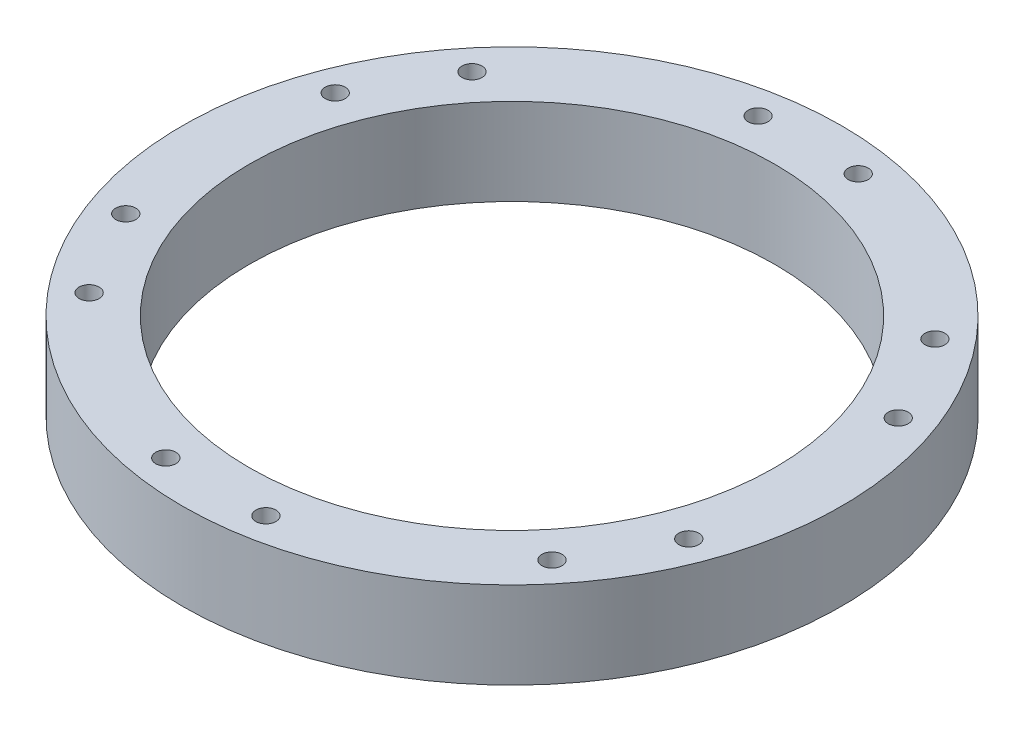
ISO-10303-21;
HEADER;
FILE_DESCRIPTION(('STEP AP214'),'2;1');
FILE_NAME('part.step','',(''),(''),'','','');
FILE_SCHEMA(('AUTOMOTIVE_DESIGN { 1 0 10303 214 1 1 1 1 }'));
ENDSEC;
DATA;
#1=APPLICATION_CONTEXT('core data for automotive mechanical design processes');
#2=APPLICATION_PROTOCOL_DEFINITION('international standard','automotive_design',2000,#1);
#3=PRODUCT_CONTEXT('',#1,'mechanical');
#4=PRODUCT('Part','Part','',(#3));
#5=PRODUCT_RELATED_PRODUCT_CATEGORY('part','',(#4));
#6=PRODUCT_DEFINITION_FORMATION('','',#4);
#7=PRODUCT_DEFINITION_CONTEXT('part definition',#1,'design');
#8=PRODUCT_DEFINITION('design','',#6,#7);
#9=PRODUCT_DEFINITION_SHAPE('','',#8);
#10=(LENGTH_UNIT() NAMED_UNIT(*) SI_UNIT(.MILLI.,.METRE.));
#11=(NAMED_UNIT(*) PLANE_ANGLE_UNIT() SI_UNIT($,.RADIAN.));
#12=(NAMED_UNIT(*) SI_UNIT($,.STERADIAN.) SOLID_ANGLE_UNIT());
#13=UNCERTAINTY_MEASURE_WITH_UNIT(LENGTH_MEASURE(1.E-05),#10,'distance_accuracy_value','');
#14=(GEOMETRIC_REPRESENTATION_CONTEXT(3) GLOBAL_UNCERTAINTY_ASSIGNED_CONTEXT((#13)) GLOBAL_UNIT_ASSIGNED_CONTEXT((#10,
#11,#12)) REPRESENTATION_CONTEXT('',''));
#15=CARTESIAN_POINT('',(0.,0.,0.));
#16=DIRECTION('',(0.,0.,1.));
#17=DIRECTION('',(1.,0.,0.));
#18=AXIS2_PLACEMENT_3D('',#15,#16,#17);
#19=CARTESIAN_POINT('',(0.,13.,0.));
#20=DIRECTION('',(0.,1.,0.));
#21=DIRECTION('',(0.,0.,1.));
#22=AXIS2_PLACEMENT_3D('',#19,#20,#21);
#23=PLANE('',#22);
#24=CARTESIAN_POINT('',(-34.6760653723481,13.,28.6804897150073));
#25=DIRECTION('',(0.,1.,0.));
#26=DIRECTION('',(-0.866025403784433,0.,0.50000000000001));
#27=AXIS2_PLACEMENT_3D('',#24,#25,#26);
#28=CIRCLE('',#27,1.5);
#29=CARTESIAN_POINT('',(-35.9751034780248,13.,29.4304897150073));
#30=VERTEX_POINT('',#29);
#31=EDGE_CURVE('E72',#30,#30,#28,.T.);
#32=ORIENTED_EDGE('',*,*,#31,.F.);
#33=EDGE_LOOP('',(#32));
#34=FACE_BOUND('',#33,.T.);
#35=CARTESIAN_POINT('',(-42.1760653723483,13.,15.6901086582408));
#36=DIRECTION('',(0.,1.,0.));
#37=DIRECTION('',(-0.866025403784433,0.,0.50000000000001));
#38=AXIS2_PLACEMENT_3D('',#35,#36,#37);
#39=CIRCLE('',#38,1.5);
#40=CARTESIAN_POINT('',(-43.475103478025,13.,16.4401086582408));
#41=VERTEX_POINT('',#40);
#42=EDGE_CURVE('E71',#41,#41,#39,.T.);
#43=ORIENTED_EDGE('',*,*,#42,.F.);
#44=EDGE_LOOP('',(#43));
#45=FACE_BOUND('',#44,.T.);
#46=CARTESIAN_POINT('',(-42.1760653723486,13.,-15.6901086582399));
#47=DIRECTION('',(0.,1.,0.));
#48=DIRECTION('',(-0.866025403784443,0.,-0.499999999999992));
#49=AXIS2_PLACEMENT_3D('',#46,#47,#48);
#50=CIRCLE('',#49,1.5);
#51=CARTESIAN_POINT('',(-43.4751034780253,13.,-16.4401086582399));
#52=VERTEX_POINT('',#51);
#53=EDGE_CURVE('E78',#52,#52,#50,.T.);
#54=ORIENTED_EDGE('',*,*,#53,.F.);
#55=EDGE_LOOP('',(#54));
#56=FACE_BOUND('',#55,.T.);
#57=CARTESIAN_POINT('',(-34.6760653723488,13.,-28.6804897150065));
#58=DIRECTION('',(0.,1.,0.));
#59=DIRECTION('',(-0.866025403784443,0.,-0.499999999999992));
#60=AXIS2_PLACEMENT_3D('',#57,#58,#59);
#61=CIRCLE('',#60,1.5);
#62=CARTESIAN_POINT('',(-35.9751034780254,13.,-29.4304897150065));
#63=VERTEX_POINT('',#62);
#64=EDGE_CURVE('E84',#63,#63,#61,.T.);
#65=ORIENTED_EDGE('',*,*,#64,.F.);
#66=EDGE_LOOP('',(#65));
#67=FACE_BOUND('',#66,.T.);
#68=CARTESIAN_POINT('',(-7.50000000000001,13.,-44.3705983732471));
#69=DIRECTION('',(0.,1.,0.));
#70=DIRECTION('',(0.,0.,-1.));
#71=AXIS2_PLACEMENT_3D('',#68,#69,#70);
#72=CIRCLE('',#71,1.5);
#73=CARTESIAN_POINT('',(-7.50000000000001,13.,-45.8705983732471));
#74=VERTEX_POINT('',#73);
#75=EDGE_CURVE('E90',#74,#74,#72,.T.);
#76=ORIENTED_EDGE('',*,*,#75,.F.);
#77=EDGE_LOOP('',(#76));
#78=FACE_BOUND('',#77,.T.);
#79=CARTESIAN_POINT('',(7.49999999999999,13.,-44.3705983732471));
#80=DIRECTION('',(0.,1.,0.));
#81=DIRECTION('',(0.,0.,-1.));
#82=AXIS2_PLACEMENT_3D('',#79,#80,#81);
#83=CIRCLE('',#82,1.5);
#84=CARTESIAN_POINT('',(7.49999999999999,13.,-45.8705983732471));
#85=VERTEX_POINT('',#84);
#86=EDGE_CURVE('E96',#85,#85,#83,.T.);
#87=ORIENTED_EDGE('',*,*,#86,.F.);
#88=EDGE_LOOP('',(#87));
#89=FACE_BOUND('',#88,.T.);
#90=CARTESIAN_POINT('',(34.6760653723484,13.,-28.680489715007));
#91=DIRECTION('',(0.,1.,0.));
#92=DIRECTION('',(0.866025403784436,0.,-0.500000000000004));
#93=AXIS2_PLACEMENT_3D('',#90,#91,#92);
#94=CIRCLE('',#93,1.5);
#95=CARTESIAN_POINT('',(35.975103478025,13.,-29.430489715007));
#96=VERTEX_POINT('',#95);
#97=EDGE_CURVE('E102',#96,#96,#94,.T.);
#98=ORIENTED_EDGE('',*,*,#97,.F.);
#99=EDGE_LOOP('',(#98));
#100=FACE_BOUND('',#99,.T.);
#101=CARTESIAN_POINT('',(42.1760653723484,13.,-15.6901086582405));
#102=DIRECTION('',(0.,1.,0.));
#103=DIRECTION('',(0.866025403784436,0.,-0.500000000000004));
#104=AXIS2_PLACEMENT_3D('',#101,#102,#103);
#105=CIRCLE('',#104,1.5);
#106=CARTESIAN_POINT('',(43.4751034780251,13.,-16.4401086582405));
#107=VERTEX_POINT('',#106);
#108=EDGE_CURVE('E108',#107,#107,#105,.T.);
#109=ORIENTED_EDGE('',*,*,#108,.F.);
#110=EDGE_LOOP('',(#109));
#111=FACE_BOUND('',#110,.T.);
#112=CARTESIAN_POINT('',(42.1760653723485,13.,15.6901086582402));
#113=DIRECTION('',(0.,1.,0.));
#114=DIRECTION('',(0.86602540378444,0.,0.499999999999998));
#115=AXIS2_PLACEMENT_3D('',#112,#113,#114);
#116=CIRCLE('',#115,1.5);
#117=CARTESIAN_POINT('',(43.4751034780252,13.,16.4401086582402));
#118=VERTEX_POINT('',#117);
#119=EDGE_CURVE('E114',#118,#118,#116,.T.);
#120=ORIENTED_EDGE('',*,*,#119,.F.);
#121=EDGE_LOOP('',(#120));
#122=FACE_BOUND('',#121,.T.);
#123=CARTESIAN_POINT('',(34.6760653723486,13.,28.6804897150068));
#124=DIRECTION('',(0.,1.,0.));
#125=DIRECTION('',(0.86602540378444,0.,0.499999999999998));
#126=AXIS2_PLACEMENT_3D('',#123,#124,#125);
#127=CIRCLE('',#126,1.5);
#128=CARTESIAN_POINT('',(35.9751034780252,13.,29.4304897150068));
#129=VERTEX_POINT('',#128);
#130=EDGE_CURVE('E64',#129,#129,#127,.T.);
#131=ORIENTED_EDGE('',*,*,#130,.F.);
#132=EDGE_LOOP('',(#131));
#133=FACE_BOUND('',#132,.T.);
#134=CARTESIAN_POINT('',(-7.49999999999999,13.,44.3705983732471));
#135=DIRECTION('',(0.,1.,0.));
#136=DIRECTION('',(0.,0.,1.));
#137=AXIS2_PLACEMENT_3D('',#134,#135,#136);
#138=CIRCLE('',#137,1.5);
#139=CARTESIAN_POINT('',(-7.49999999999999,13.,45.8705983732471));
#140=VERTEX_POINT('',#139);
#141=EDGE_CURVE('E53',#140,#140,#138,.T.);
#142=ORIENTED_EDGE('',*,*,#141,.F.);
#143=EDGE_LOOP('',(#142));
#144=FACE_BOUND('',#143,.T.);
#145=CARTESIAN_POINT('',(7.50000000000001,13.,44.3705983732471));
#146=DIRECTION('',(0.,1.,0.));
#147=DIRECTION('',(0.,0.,1.));
#148=AXIS2_PLACEMENT_3D('',#145,#146,#147);
#149=CIRCLE('',#148,1.5);
#150=CARTESIAN_POINT('',(7.50000000000001,13.,45.8705983732471));
#151=VERTEX_POINT('',#150);
#152=EDGE_CURVE('E54',#151,#151,#149,.T.);
#153=ORIENTED_EDGE('',*,*,#152,.F.);
#154=EDGE_LOOP('',(#153));
#155=FACE_BOUND('',#154,.T.);
#156=CARTESIAN_POINT('',(0.,13.,0.));
#157=DIRECTION('',(0.,1.,0.));
#158=DIRECTION('',(0.,0.,1.));
#159=AXIS2_PLACEMENT_3D('',#156,#157,#158);
#160=CIRCLE('',#159,49.375);
#161=CARTESIAN_POINT('',(0.,13.,-49.375));
#162=VERTEX_POINT('',#161);
#163=EDGE_CURVE('E10',#162,#162,#160,.T.);
#164=ORIENTED_EDGE('',*,*,#163,.T.);
#165=EDGE_LOOP('',(#164));
#166=FACE_BOUND('',#165,.T.);
#167=CARTESIAN_POINT('',(0.,13.,0.));
#168=DIRECTION('',(0.,1.,0.));
#169=DIRECTION('',(0.,0.,1.));
#170=AXIS2_PLACEMENT_3D('',#167,#168,#169);
#171=CIRCLE('',#170,39.375);
#172=CARTESIAN_POINT('',(0.,13.,-39.375));
#173=VERTEX_POINT('',#172);
#174=EDGE_CURVE('E42',#173,#173,#171,.T.);
#175=ORIENTED_EDGE('',*,*,#174,.F.);
#176=EDGE_LOOP('',(#175));
#177=FACE_BOUND('',#176,.T.);
#178=ADVANCED_FACE('F31',(#34,#45,#56,#67,#78,#89,#100,#111,#122,#133,#144,#155,#166,#177),#23,.T.);
#179=CARTESIAN_POINT('',(0.,0.,0.));
#180=DIRECTION('',(0.,1.,0.));
#181=DIRECTION('',(0.,0.,1.));
#182=AXIS2_PLACEMENT_3D('',#179,#180,#181);
#183=PLANE('',#182);
#184=CARTESIAN_POINT('',(-34.6760653723481,0.,28.6804897150073));
#185=DIRECTION('',(0.,1.,0.));
#186=DIRECTION('',(0.,0.,1.));
#187=AXIS2_PLACEMENT_3D('',#184,#185,#186);
#188=CIRCLE('',#187,1.5);
#189=CARTESIAN_POINT('',(-34.6760653723481,0.,30.1804897150073));
#190=VERTEX_POINT('',#189);
#191=EDGE_CURVE('E68',#190,#190,#188,.F.);
#192=ORIENTED_EDGE('',*,*,#191,.F.);
#193=EDGE_LOOP('',(#192));
#194=FACE_BOUND('',#193,.T.);
#195=CARTESIAN_POINT('',(-42.1760653723483,0.,15.6901086582408));
#196=DIRECTION('',(0.,1.,0.));
#197=DIRECTION('',(0.,0.,1.));
#198=AXIS2_PLACEMENT_3D('',#195,#196,#197);
#199=CIRCLE('',#198,1.5);
#200=CARTESIAN_POINT('',(-42.1760653723483,0.,17.1901086582408));
#201=VERTEX_POINT('',#200);
#202=EDGE_CURVE('E75',#201,#201,#199,.F.);
#203=ORIENTED_EDGE('',*,*,#202,.F.);
#204=EDGE_LOOP('',(#203));
#205=FACE_BOUND('',#204,.T.);
#206=CARTESIAN_POINT('',(-42.1760653723486,0.,-15.6901086582399));
#207=DIRECTION('',(0.,1.,0.));
#208=DIRECTION('',(0.,0.,1.));
#209=AXIS2_PLACEMENT_3D('',#206,#207,#208);
#210=CIRCLE('',#209,1.5);
#211=CARTESIAN_POINT('',(-42.1760653723486,0.,-14.1901086582399));
#212=VERTEX_POINT('',#211);
#213=EDGE_CURVE('E81',#212,#212,#210,.F.);
#214=ORIENTED_EDGE('',*,*,#213,.F.);
#215=EDGE_LOOP('',(#214));
#216=FACE_BOUND('',#215,.T.);
#217=CARTESIAN_POINT('',(-34.6760653723488,0.,-28.6804897150065));
#218=DIRECTION('',(0.,1.,0.));
#219=DIRECTION('',(0.,0.,1.));
#220=AXIS2_PLACEMENT_3D('',#217,#218,#219);
#221=CIRCLE('',#220,1.5);
#222=CARTESIAN_POINT('',(-34.6760653723488,0.,-27.1804897150065));
#223=VERTEX_POINT('',#222);
#224=EDGE_CURVE('E87',#223,#223,#221,.F.);
#225=ORIENTED_EDGE('',*,*,#224,.F.);
#226=EDGE_LOOP('',(#225));
#227=FACE_BOUND('',#226,.T.);
#228=CARTESIAN_POINT('',(-7.50000000000001,0.,-44.3705983732471));
#229=DIRECTION('',(0.,1.,0.));
#230=DIRECTION('',(0.,0.,1.));
#231=AXIS2_PLACEMENT_3D('',#228,#229,#230);
#232=CIRCLE('',#231,1.5);
#233=CARTESIAN_POINT('',(-7.50000000000001,0.,-42.8705983732471));
#234=VERTEX_POINT('',#233);
#235=EDGE_CURVE('E93',#234,#234,#232,.F.);
#236=ORIENTED_EDGE('',*,*,#235,.F.);
#237=EDGE_LOOP('',(#236));
#238=FACE_BOUND('',#237,.T.);
#239=CARTESIAN_POINT('',(7.49999999999999,0.,-44.3705983732471));
#240=DIRECTION('',(0.,1.,0.));
#241=DIRECTION('',(0.,0.,1.));
#242=AXIS2_PLACEMENT_3D('',#239,#240,#241);
#243=CIRCLE('',#242,1.5);
#244=CARTESIAN_POINT('',(7.49999999999999,0.,-42.8705983732471));
#245=VERTEX_POINT('',#244);
#246=EDGE_CURVE('E99',#245,#245,#243,.F.);
#247=ORIENTED_EDGE('',*,*,#246,.F.);
#248=EDGE_LOOP('',(#247));
#249=FACE_BOUND('',#248,.T.);
#250=CARTESIAN_POINT('',(34.6760653723484,0.,-28.680489715007));
#251=DIRECTION('',(0.,1.,0.));
#252=DIRECTION('',(0.,0.,1.));
#253=AXIS2_PLACEMENT_3D('',#250,#251,#252);
#254=CIRCLE('',#253,1.5);
#255=CARTESIAN_POINT('',(34.6760653723484,0.,-27.180489715007));
#256=VERTEX_POINT('',#255);
#257=EDGE_CURVE('E105',#256,#256,#254,.F.);
#258=ORIENTED_EDGE('',*,*,#257,.F.);
#259=EDGE_LOOP('',(#258));
#260=FACE_BOUND('',#259,.T.);
#261=CARTESIAN_POINT('',(42.1760653723484,0.,-15.6901086582405));
#262=DIRECTION('',(0.,1.,0.));
#263=DIRECTION('',(0.,0.,1.));
#264=AXIS2_PLACEMENT_3D('',#261,#262,#263);
#265=CIRCLE('',#264,1.5);
#266=CARTESIAN_POINT('',(42.1760653723484,0.,-14.1901086582405));
#267=VERTEX_POINT('',#266);
#268=EDGE_CURVE('E111',#267,#267,#265,.F.);
#269=ORIENTED_EDGE('',*,*,#268,.F.);
#270=EDGE_LOOP('',(#269));
#271=FACE_BOUND('',#270,.T.);
#272=CARTESIAN_POINT('',(42.1760653723485,0.,15.6901086582402));
#273=DIRECTION('',(0.,1.,0.));
#274=DIRECTION('',(0.,0.,1.));
#275=AXIS2_PLACEMENT_3D('',#272,#273,#274);
#276=CIRCLE('',#275,1.5);
#277=CARTESIAN_POINT('',(42.1760653723485,0.,17.1901086582402));
#278=VERTEX_POINT('',#277);
#279=EDGE_CURVE('E67',#278,#278,#276,.F.);
#280=ORIENTED_EDGE('',*,*,#279,.F.);
#281=EDGE_LOOP('',(#280));
#282=FACE_BOUND('',#281,.T.);
#283=CARTESIAN_POINT('',(34.6760653723486,0.,28.6804897150068));
#284=DIRECTION('',(0.,1.,0.));
#285=DIRECTION('',(0.,0.,1.));
#286=AXIS2_PLACEMENT_3D('',#283,#284,#285);
#287=CIRCLE('',#286,1.5);
#288=CARTESIAN_POINT('',(34.6760653723486,0.,30.1804897150068));
#289=VERTEX_POINT('',#288);
#290=EDGE_CURVE('E57',#289,#289,#287,.F.);
#291=ORIENTED_EDGE('',*,*,#290,.F.);
#292=EDGE_LOOP('',(#291));
#293=FACE_BOUND('',#292,.T.);
#294=CARTESIAN_POINT('',(-7.49999999999999,0.,44.3705983732471));
#295=DIRECTION('',(0.,1.,0.));
#296=DIRECTION('',(0.,0.,1.));
#297=AXIS2_PLACEMENT_3D('',#294,#295,#296);
#298=CIRCLE('',#297,1.5);
#299=CARTESIAN_POINT('',(-7.49999999999999,0.,45.8705983732471));
#300=VERTEX_POINT('',#299);
#301=EDGE_CURVE('E47',#300,#300,#298,.F.);
#302=ORIENTED_EDGE('',*,*,#301,.F.);
#303=EDGE_LOOP('',(#302));
#304=FACE_BOUND('',#303,.T.);
#305=CARTESIAN_POINT('',(7.50000000000001,0.,44.3705983732471));
#306=DIRECTION('',(0.,1.,0.));
#307=DIRECTION('',(0.,0.,1.));
#308=AXIS2_PLACEMENT_3D('',#305,#306,#307);
#309=CIRCLE('',#308,1.5);
#310=CARTESIAN_POINT('',(7.50000000000001,0.,45.8705983732471));
#311=VERTEX_POINT('',#310);
#312=EDGE_CURVE('E50',#311,#311,#309,.F.);
#313=ORIENTED_EDGE('',*,*,#312,.F.);
#314=EDGE_LOOP('',(#313));
#315=FACE_BOUND('',#314,.T.);
#316=CARTESIAN_POINT('',(0.,0.,0.));
#317=DIRECTION('',(0.,1.,0.));
#318=DIRECTION('',(0.,0.,1.));
#319=AXIS2_PLACEMENT_3D('',#316,#317,#318);
#320=CIRCLE('',#319,49.375);
#321=CARTESIAN_POINT('',(0.,0.,-49.375));
#322=VERTEX_POINT('',#321);
#323=EDGE_CURVE('E35',#322,#322,#320,.T.);
#324=ORIENTED_EDGE('',*,*,#323,.F.);
#325=EDGE_LOOP('',(#324));
#326=FACE_BOUND('',#325,.T.);
#327=CARTESIAN_POINT('',(0.,0.,0.));
#328=DIRECTION('',(0.,1.,0.));
#329=DIRECTION('',(0.,0.,1.));
#330=AXIS2_PLACEMENT_3D('',#327,#328,#329);
#331=CIRCLE('',#330,39.375);
#332=CARTESIAN_POINT('',(0.,0.,-39.375));
#333=VERTEX_POINT('',#332);
#334=EDGE_CURVE('E44',#333,#333,#331,.T.);
#335=ORIENTED_EDGE('',*,*,#334,.T.);
#336=EDGE_LOOP('',(#335));
#337=FACE_BOUND('',#336,.T.);
#338=ADVANCED_FACE('F127',(#194,#205,#216,#227,#238,#249,#260,#271,#282,#293,#304,#315,#326,
#337),#183,.F.);
#339=CARTESIAN_POINT('',(0.,13.,0.));
#340=DIRECTION('',(0.,-1.,0.));
#341=DIRECTION('',(0.,0.,-1.));
#342=AXIS2_PLACEMENT_3D('',#339,#340,#341);
#343=CYLINDRICAL_SURFACE('',#342,49.375);
#344=CARTESIAN_POINT('',(0.,13.,-49.375));
#345=CARTESIAN_POINT('',(0.,12.8645833333333,-49.375));
#346=CARTESIAN_POINT('',(0.,12.7291666666667,-49.375));
#347=CARTESIAN_POINT('',(0.,12.4583333333333,-49.375));
#348=CARTESIAN_POINT('',(0.,12.3229166666667,-49.375));
#349=CARTESIAN_POINT('',(0.,12.0520833333333,-49.375));
#350=CARTESIAN_POINT('',(0.,11.9166666666667,-49.375));
#351=CARTESIAN_POINT('',(0.,11.6458333333333,-49.375));
#352=CARTESIAN_POINT('',(0.,11.5104166666667,-49.375));
#353=CARTESIAN_POINT('',(0.,11.2395833333333,-49.375));
#354=CARTESIAN_POINT('',(0.,11.1041666666667,-49.375));
#355=CARTESIAN_POINT('',(0.,10.8333333333333,-49.375));
#356=CARTESIAN_POINT('',(0.,10.6979166666667,-49.375));
#357=CARTESIAN_POINT('',(0.,10.4270833333333,-49.375));
#358=CARTESIAN_POINT('',(0.,10.2916666666667,-49.375));
#359=CARTESIAN_POINT('',(0.,10.0208333333333,-49.375));
#360=CARTESIAN_POINT('',(0.,9.88541666666667,-49.375));
#361=CARTESIAN_POINT('',(0.,9.61458333333333,-49.375));
#362=CARTESIAN_POINT('',(0.,9.47916666666667,-49.375));
#363=CARTESIAN_POINT('',(0.,9.20833333333333,-49.375));
#364=CARTESIAN_POINT('',(0.,9.07291666666667,-49.375));
#365=CARTESIAN_POINT('',(0.,8.80208333333333,-49.375));
#366=CARTESIAN_POINT('',(0.,8.66666666666667,-49.375));
#367=CARTESIAN_POINT('',(0.,8.39583333333333,-49.375));
#368=CARTESIAN_POINT('',(0.,8.26041666666667,-49.375));
#369=CARTESIAN_POINT('',(0.,7.98958333333333,-49.375));
#370=CARTESIAN_POINT('',(0.,7.85416666666667,-49.375));
#371=CARTESIAN_POINT('',(0.,7.58333333333333,-49.375));
#372=CARTESIAN_POINT('',(0.,7.44791666666667,-49.375));
#373=CARTESIAN_POINT('',(0.,7.17708333333333,-49.375));
#374=CARTESIAN_POINT('',(0.,7.04166666666667,-49.375));
#375=CARTESIAN_POINT('',(0.,6.77083333333333,-49.375));
#376=CARTESIAN_POINT('',(0.,6.63541666666667,-49.375));
#377=CARTESIAN_POINT('',(0.,6.36458333333333,-49.375));
#378=CARTESIAN_POINT('',(0.,6.22916666666667,-49.375));
#379=CARTESIAN_POINT('',(0.,5.95833333333333,-49.375));
#380=CARTESIAN_POINT('',(0.,5.82291666666667,-49.375));
#381=CARTESIAN_POINT('',(0.,5.55208333333333,-49.375));
#382=CARTESIAN_POINT('',(0.,5.41666666666667,-49.375));
#383=CARTESIAN_POINT('',(0.,5.14583333333333,-49.375));
#384=CARTESIAN_POINT('',(0.,5.01041666666667,-49.375));
#385=CARTESIAN_POINT('',(0.,4.73958333333333,-49.375));
#386=CARTESIAN_POINT('',(0.,4.60416666666667,-49.375));
#387=CARTESIAN_POINT('',(0.,4.33333333333333,-49.375));
#388=CARTESIAN_POINT('',(0.,4.19791666666667,-49.375));
#389=CARTESIAN_POINT('',(0.,3.92708333333333,-49.375));
#390=CARTESIAN_POINT('',(0.,3.79166666666667,-49.375));
#391=CARTESIAN_POINT('',(0.,3.52083333333333,-49.375));
#392=CARTESIAN_POINT('',(0.,3.38541666666667,-49.375));
#393=CARTESIAN_POINT('',(0.,3.11458333333333,-49.375));
#394=CARTESIAN_POINT('',(0.,2.97916666666667,-49.375));
#395=CARTESIAN_POINT('',(0.,2.70833333333333,-49.375));
#396=CARTESIAN_POINT('',(0.,2.57291666666667,-49.375));
#397=CARTESIAN_POINT('',(0.,2.30208333333333,-49.375));
#398=CARTESIAN_POINT('',(0.,2.16666666666667,-49.375));
#399=CARTESIAN_POINT('',(0.,1.89583333333333,-49.375));
#400=CARTESIAN_POINT('',(0.,1.76041666666667,-49.375));
#401=CARTESIAN_POINT('',(0.,1.48958333333333,-49.375));
#402=CARTESIAN_POINT('',(0.,1.35416666666667,-49.375));
#403=CARTESIAN_POINT('',(0.,1.08333333333333,-49.375));
#404=CARTESIAN_POINT('',(0.,0.947916666666667,-49.375));
#405=CARTESIAN_POINT('',(0.,0.677083333333334,-49.375));
#406=CARTESIAN_POINT('',(0.,0.541666666666667,-49.375));
#407=CARTESIAN_POINT('',(0.,0.270833333333334,-49.375));
#408=CARTESIAN_POINT('',(0.,0.135416666666667,-49.375));
#409=CARTESIAN_POINT('',(0.,0.,-49.375));
#410=B_SPLINE_CURVE_WITH_KNOTS('',3,(#344,#345,#346,#347,#348,#349,#350,#351,#352,#353,#354,
#355,#356,#357,#358,#359,#360,#361,#362,#363,#364,#365,#366,#367,#368,#369,#370,#371,#372,#373,
#374,#375,#376,#377,#378,#379,#380,#381,#382,#383,#384,#385,#386,#387,#388,#389,#390,#391,#392,
#393,#394,#395,#396,#397,#398,#399,#400,#401,#402,#403,#404,#405,#406,#407,#408,#409),
.UNSPECIFIED.,.F.,.F.,(4,2,2,2,2,2,2,2,2,2,2,2,2,2,2,2,2,2,2,2,2,2,2,2,2,2,2,2,2,2,2,2,4),(0.,
0.406249999999999,0.812499999999999,1.21875,1.625,2.03125,2.4375,2.84375,3.25,3.65625,4.0625,
4.46875,4.875,5.28125,5.6875,6.09375,6.5,6.90625,7.3125,7.71875,8.125,8.53125,8.9375,9.34375,
9.75,10.15625,10.5625,10.96875,11.375,11.78125,12.1875,12.59375,13.),.UNSPECIFIED.);
#411=EDGE_CURVE('BSEAM33',#162,#322,#410,.T.);
#412=ORIENTED_EDGE('',*,*,#163,.F.);
#413=ORIENTED_EDGE('',*,*,#323,.T.);
#414=ORIENTED_EDGE('',*,*,#411,.T.);
#415=ORIENTED_EDGE('',*,*,#411,.F.);
#416=EDGE_LOOP('',(#412,#414,#413,#415));
#417=FACE_BOUND('',#416,.T.);
#418=ADVANCED_FACE('F33',(#417),#343,.T.);
#419=CARTESIAN_POINT('',(0.,13.,0.));
#420=DIRECTION('',(0.,-1.,0.));
#421=DIRECTION('',(0.,0.,-1.));
#422=AXIS2_PLACEMENT_3D('',#419,#420,#421);
#423=CYLINDRICAL_SURFACE('',#422,39.375);
#424=CARTESIAN_POINT('',(0.,13.,-39.375));
#425=CARTESIAN_POINT('',(0.,12.8645833333333,-39.375));
#426=CARTESIAN_POINT('',(0.,12.7291666666667,-39.375));
#427=CARTESIAN_POINT('',(0.,12.4583333333333,-39.375));
#428=CARTESIAN_POINT('',(0.,12.3229166666667,-39.375));
#429=CARTESIAN_POINT('',(0.,12.0520833333333,-39.375));
#430=CARTESIAN_POINT('',(0.,11.9166666666667,-39.375));
#431=CARTESIAN_POINT('',(0.,11.6458333333333,-39.375));
#432=CARTESIAN_POINT('',(0.,11.5104166666667,-39.375));
#433=CARTESIAN_POINT('',(0.,11.2395833333333,-39.375));
#434=CARTESIAN_POINT('',(0.,11.1041666666667,-39.375));
#435=CARTESIAN_POINT('',(0.,10.8333333333333,-39.375));
#436=CARTESIAN_POINT('',(0.,10.6979166666667,-39.375));
#437=CARTESIAN_POINT('',(0.,10.4270833333333,-39.375));
#438=CARTESIAN_POINT('',(0.,10.2916666666667,-39.375));
#439=CARTESIAN_POINT('',(0.,10.0208333333333,-39.375));
#440=CARTESIAN_POINT('',(0.,9.88541666666667,-39.375));
#441=CARTESIAN_POINT('',(0.,9.61458333333333,-39.375));
#442=CARTESIAN_POINT('',(0.,9.47916666666667,-39.375));
#443=CARTESIAN_POINT('',(0.,9.20833333333333,-39.375));
#444=CARTESIAN_POINT('',(0.,9.07291666666666,-39.375));
#445=CARTESIAN_POINT('',(0.,8.80208333333333,-39.375));
#446=CARTESIAN_POINT('',(0.,8.66666666666667,-39.375));
#447=CARTESIAN_POINT('',(0.,8.39583333333333,-39.375));
#448=CARTESIAN_POINT('',(0.,8.26041666666667,-39.375));
#449=CARTESIAN_POINT('',(0.,7.98958333333333,-39.375));
#450=CARTESIAN_POINT('',(0.,7.85416666666667,-39.375));
#451=CARTESIAN_POINT('',(0.,7.58333333333333,-39.375));
#452=CARTESIAN_POINT('',(0.,7.44791666666667,-39.375));
#453=CARTESIAN_POINT('',(0.,7.17708333333333,-39.375));
#454=CARTESIAN_POINT('',(0.,7.04166666666667,-39.375));
#455=CARTESIAN_POINT('',(0.,6.77083333333333,-39.375));
#456=CARTESIAN_POINT('',(0.,6.63541666666667,-39.375));
#457=CARTESIAN_POINT('',(0.,6.36458333333333,-39.375));
#458=CARTESIAN_POINT('',(0.,6.22916666666667,-39.375));
#459=CARTESIAN_POINT('',(0.,5.95833333333333,-39.375));
#460=CARTESIAN_POINT('',(0.,5.82291666666667,-39.375));
#461=CARTESIAN_POINT('',(0.,5.55208333333333,-39.375));
#462=CARTESIAN_POINT('',(0.,5.41666666666667,-39.375));
#463=CARTESIAN_POINT('',(0.,5.14583333333333,-39.375));
#464=CARTESIAN_POINT('',(0.,5.01041666666667,-39.375));
#465=CARTESIAN_POINT('',(0.,4.73958333333333,-39.375));
#466=CARTESIAN_POINT('',(0.,4.60416666666667,-39.375));
#467=CARTESIAN_POINT('',(0.,4.33333333333333,-39.375));
#468=CARTESIAN_POINT('',(0.,4.19791666666667,-39.375));
#469=CARTESIAN_POINT('',(0.,3.92708333333333,-39.375));
#470=CARTESIAN_POINT('',(0.,3.79166666666667,-39.375));
#471=CARTESIAN_POINT('',(0.,3.52083333333333,-39.375));
#472=CARTESIAN_POINT('',(0.,3.38541666666667,-39.375));
#473=CARTESIAN_POINT('',(0.,3.11458333333333,-39.375));
#474=CARTESIAN_POINT('',(0.,2.97916666666667,-39.375));
#475=CARTESIAN_POINT('',(0.,2.70833333333333,-39.375));
#476=CARTESIAN_POINT('',(0.,2.57291666666667,-39.375));
#477=CARTESIAN_POINT('',(0.,2.30208333333333,-39.375));
#478=CARTESIAN_POINT('',(0.,2.16666666666667,-39.375));
#479=CARTESIAN_POINT('',(0.,1.89583333333333,-39.375));
#480=CARTESIAN_POINT('',(0.,1.76041666666667,-39.375));
#481=CARTESIAN_POINT('',(0.,1.48958333333333,-39.375));
#482=CARTESIAN_POINT('',(0.,1.35416666666667,-39.375));
#483=CARTESIAN_POINT('',(0.,1.08333333333333,-39.375));
#484=CARTESIAN_POINT('',(0.,0.947916666666667,-39.375));
#485=CARTESIAN_POINT('',(0.,0.677083333333334,-39.375));
#486=CARTESIAN_POINT('',(0.,0.541666666666667,-39.375));
#487=CARTESIAN_POINT('',(0.,0.270833333333334,-39.375));
#488=CARTESIAN_POINT('',(0.,0.135416666666667,-39.375));
#489=CARTESIAN_POINT('',(0.,0.,-39.375));
#490=B_SPLINE_CURVE_WITH_KNOTS('',3,(#424,#425,#426,#427,#428,#429,#430,#431,#432,#433,#434,
#435,#436,#437,#438,#439,#440,#441,#442,#443,#444,#445,#446,#447,#448,#449,#450,#451,#452,#453,
#454,#455,#456,#457,#458,#459,#460,#461,#462,#463,#464,#465,#466,#467,#468,#469,#470,#471,#472,
#473,#474,#475,#476,#477,#478,#479,#480,#481,#482,#483,#484,#485,#486,#487,#488,#489),
.UNSPECIFIED.,.F.,.F.,(4,2,2,2,2,2,2,2,2,2,2,2,2,2,2,2,2,2,2,2,2,2,2,2,2,2,2,2,2,2,2,2,4),(0.,
0.40625,0.812500000000001,1.21875,1.625,2.03125,2.4375,2.84375,3.25,3.65625,4.0625,4.46875,
4.875,5.28125,5.6875,6.09375,6.5,6.90625,7.3125,7.71875,8.125,8.53125,8.9375,9.34375,9.75,
10.15625,10.5625,10.96875,11.375,11.78125,12.1875,12.59375,13.),.UNSPECIFIED.);
#491=EDGE_CURVE('BSEAM138',#173,#333,#490,.T.);
#492=ORIENTED_EDGE('',*,*,#174,.T.);
#493=ORIENTED_EDGE('',*,*,#334,.F.);
#494=ORIENTED_EDGE('',*,*,#491,.T.);
#495=ORIENTED_EDGE('',*,*,#491,.F.);
#496=EDGE_LOOP('',(#492,#494,#493,#495));
#497=FACE_BOUND('',#496,.T.);
#498=ADVANCED_FACE('F138',(#497),#423,.F.);
#499=CARTESIAN_POINT('',(7.50000000000001,-0.000999999999999265,44.3705983732471));
#500=DIRECTION('',(0.,1.,0.));
#501=DIRECTION('',(0.,0.,1.));
#502=AXIS2_PLACEMENT_3D('',#499,#500,#501);
#503=CYLINDRICAL_SURFACE('',#502,1.5);
#504=ORIENTED_EDGE('',*,*,#152,.T.);
#505=EDGE_LOOP('',(#504));
#506=FACE_BOUND('',#505,.T.);
#507=ORIENTED_EDGE('',*,*,#312,.T.);
#508=EDGE_LOOP('',(#507));
#509=FACE_BOUND('',#508,.T.);
#510=ADVANCED_FACE('F141',(#506,#509),#503,.F.);
#511=CARTESIAN_POINT('',(-7.49999999999999,-0.000999999999999265,44.3705983732471));
#512=DIRECTION('',(0.,1.,0.));
#513=DIRECTION('',(0.,0.,1.));
#514=AXIS2_PLACEMENT_3D('',#511,#512,#513);
#515=CYLINDRICAL_SURFACE('',#514,1.5);
#516=ORIENTED_EDGE('',*,*,#141,.T.);
#517=EDGE_LOOP('',(#516));
#518=FACE_BOUND('',#517,.T.);
#519=ORIENTED_EDGE('',*,*,#301,.T.);
#520=EDGE_LOOP('',(#519));
#521=FACE_BOUND('',#520,.T.);
#522=ADVANCED_FACE('F157',(#518,#521),#515,.F.);
#523=CARTESIAN_POINT('',(34.6760653723486,-0.000999999999999265,28.6804897150068));
#524=DIRECTION('',(0.,1.,0.));
#525=DIRECTION('',(0.,0.,1.));
#526=AXIS2_PLACEMENT_3D('',#523,#524,#525);
#527=CYLINDRICAL_SURFACE('',#526,1.5);
#528=ORIENTED_EDGE('',*,*,#130,.T.);
#529=EDGE_LOOP('',(#528));
#530=FACE_BOUND('',#529,.T.);
#531=ORIENTED_EDGE('',*,*,#290,.T.);
#532=EDGE_LOOP('',(#531));
#533=FACE_BOUND('',#532,.T.);
#534=ADVANCED_FACE('F161',(#530,#533),#527,.F.);
#535=CARTESIAN_POINT('',(42.1760653723485,-0.000999999999999265,15.6901086582402));
#536=DIRECTION('',(0.,1.,0.));
#537=DIRECTION('',(0.,0.,1.));
#538=AXIS2_PLACEMENT_3D('',#535,#536,#537);
#539=CYLINDRICAL_SURFACE('',#538,1.5);
#540=ORIENTED_EDGE('',*,*,#119,.T.);
#541=EDGE_LOOP('',(#540));
#542=FACE_BOUND('',#541,.T.);
#543=ORIENTED_EDGE('',*,*,#279,.T.);
#544=EDGE_LOOP('',(#543));
#545=FACE_BOUND('',#544,.T.);
#546=ADVANCED_FACE('F122',(#542,#545),#539,.F.);
#547=CARTESIAN_POINT('',(42.1760653723484,-0.000999999999999265,-15.6901086582405));
#548=DIRECTION('',(0.,1.,0.));
#549=DIRECTION('',(0.,0.,1.));
#550=AXIS2_PLACEMENT_3D('',#547,#548,#549);
#551=CYLINDRICAL_SURFACE('',#550,1.5);
#552=ORIENTED_EDGE('',*,*,#108,.T.);
#553=EDGE_LOOP('',(#552));
#554=FACE_BOUND('',#553,.T.);
#555=ORIENTED_EDGE('',*,*,#268,.T.);
#556=EDGE_LOOP('',(#555));
#557=FACE_BOUND('',#556,.T.);
#558=ADVANCED_FACE('F193',(#554,#557),#551,.F.);
#559=CARTESIAN_POINT('',(34.6760653723484,-0.000999999999999265,-28.680489715007));
#560=DIRECTION('',(0.,1.,0.));
#561=DIRECTION('',(0.,0.,1.));
#562=AXIS2_PLACEMENT_3D('',#559,#560,#561);
#563=CYLINDRICAL_SURFACE('',#562,1.5);
#564=ORIENTED_EDGE('',*,*,#97,.T.);
#565=EDGE_LOOP('',(#564));
#566=FACE_BOUND('',#565,.T.);
#567=ORIENTED_EDGE('',*,*,#257,.T.);
#568=EDGE_LOOP('',(#567));
#569=FACE_BOUND('',#568,.T.);
#570=ADVANCED_FACE('F189',(#566,#569),#563,.F.);
#571=CARTESIAN_POINT('',(7.49999999999999,-0.000999999999999265,-44.3705983732471));
#572=DIRECTION('',(0.,1.,0.));
#573=DIRECTION('',(0.,0.,1.));
#574=AXIS2_PLACEMENT_3D('',#571,#572,#573);
#575=CYLINDRICAL_SURFACE('',#574,1.5);
#576=ORIENTED_EDGE('',*,*,#86,.T.);
#577=EDGE_LOOP('',(#576));
#578=FACE_BOUND('',#577,.T.);
#579=ORIENTED_EDGE('',*,*,#246,.T.);
#580=EDGE_LOOP('',(#579));
#581=FACE_BOUND('',#580,.T.);
#582=ADVANCED_FACE('F185',(#578,#581),#575,.F.);
#583=CARTESIAN_POINT('',(-7.50000000000001,-0.000999999999999265,-44.3705983732471));
#584=DIRECTION('',(0.,1.,0.));
#585=DIRECTION('',(0.,0.,1.));
#586=AXIS2_PLACEMENT_3D('',#583,#584,#585);
#587=CYLINDRICAL_SURFACE('',#586,1.5);
#588=ORIENTED_EDGE('',*,*,#75,.T.);
#589=EDGE_LOOP('',(#588));
#590=FACE_BOUND('',#589,.T.);
#591=ORIENTED_EDGE('',*,*,#235,.T.);
#592=EDGE_LOOP('',(#591));
#593=FACE_BOUND('',#592,.T.);
#594=ADVANCED_FACE('F181',(#590,#593),#587,.F.);
#595=CARTESIAN_POINT('',(-34.6760653723488,-0.000999999999999265,-28.6804897150065));
#596=DIRECTION('',(0.,1.,0.));
#597=DIRECTION('',(0.,0.,1.));
#598=AXIS2_PLACEMENT_3D('',#595,#596,#597);
#599=CYLINDRICAL_SURFACE('',#598,1.5);
#600=ORIENTED_EDGE('',*,*,#64,.T.);
#601=EDGE_LOOP('',(#600));
#602=FACE_BOUND('',#601,.T.);
#603=ORIENTED_EDGE('',*,*,#224,.T.);
#604=EDGE_LOOP('',(#603));
#605=FACE_BOUND('',#604,.T.);
#606=ADVANCED_FACE('F177',(#602,#605),#599,.F.);
#607=CARTESIAN_POINT('',(-42.1760653723486,-0.000999999999999265,-15.6901086582399));
#608=DIRECTION('',(0.,1.,0.));
#609=DIRECTION('',(0.,0.,1.));
#610=AXIS2_PLACEMENT_3D('',#607,#608,#609);
#611=CYLINDRICAL_SURFACE('',#610,1.5);
#612=ORIENTED_EDGE('',*,*,#53,.T.);
#613=EDGE_LOOP('',(#612));
#614=FACE_BOUND('',#613,.T.);
#615=ORIENTED_EDGE('',*,*,#213,.T.);
#616=EDGE_LOOP('',(#615));
#617=FACE_BOUND('',#616,.T.);
#618=ADVANCED_FACE('F173',(#614,#617),#611,.F.);
#619=CARTESIAN_POINT('',(-42.1760653723483,-0.000999999999999265,15.6901086582408));
#620=DIRECTION('',(0.,1.,0.));
#621=DIRECTION('',(0.,0.,1.));
#622=AXIS2_PLACEMENT_3D('',#619,#620,#621);
#623=CYLINDRICAL_SURFACE('',#622,1.5);
#624=ORIENTED_EDGE('',*,*,#42,.T.);
#625=EDGE_LOOP('',(#624));
#626=FACE_BOUND('',#625,.T.);
#627=ORIENTED_EDGE('',*,*,#202,.T.);
#628=EDGE_LOOP('',(#627));
#629=FACE_BOUND('',#628,.T.);
#630=ADVANCED_FACE('F169',(#626,#629),#623,.F.);
#631=CARTESIAN_POINT('',(-34.6760653723481,-0.000999999999999265,28.6804897150073));
#632=DIRECTION('',(0.,1.,0.));
#633=DIRECTION('',(0.,0.,1.));
#634=AXIS2_PLACEMENT_3D('',#631,#632,#633);
#635=CYLINDRICAL_SURFACE('',#634,1.5);
#636=ORIENTED_EDGE('',*,*,#31,.T.);
#637=EDGE_LOOP('',(#636));
#638=FACE_BOUND('',#637,.T.);
#639=ORIENTED_EDGE('',*,*,#191,.T.);
#640=EDGE_LOOP('',(#639));
#641=FACE_BOUND('',#640,.T.);
#642=ADVANCED_FACE('F166',(#638,#641),#635,.F.);
#643=CLOSED_SHELL('',(#178,#338,#418,#498,#510,#522,#534,#546,#558,#570,#582,#594,#606,#618,
#630,#642));
#644=MANIFOLD_SOLID_BREP('B2',#643);
#645=ADVANCED_BREP_SHAPE_REPRESENTATION('',(#18,#644),#14);
#646=SHAPE_DEFINITION_REPRESENTATION(#9,#645);
ENDSEC;
END-ISO-10303-21;
